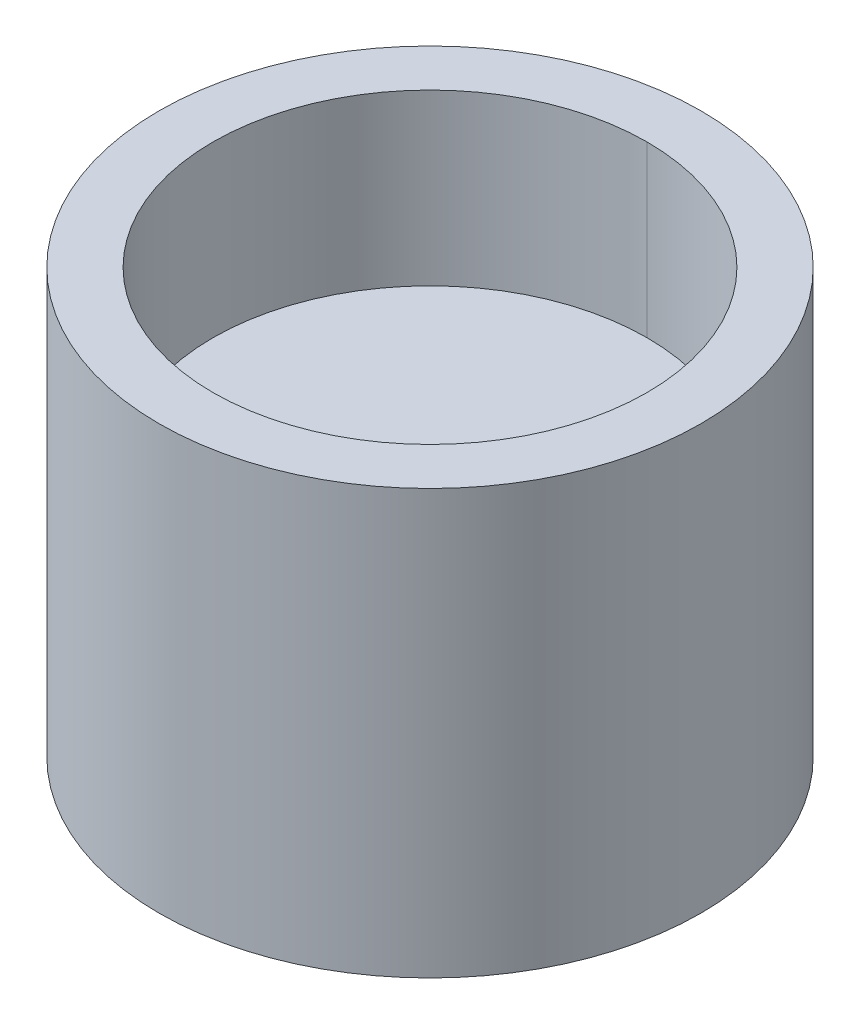
ISO-10303-21;
HEADER;
FILE_DESCRIPTION(('STEP AP214'),'2;1');
FILE_NAME('part.step','',(''),(''),'','','');
FILE_SCHEMA(('AUTOMOTIVE_DESIGN { 1 0 10303 214 1 1 1 1 }'));
ENDSEC;
DATA;
#1=APPLICATION_CONTEXT('core data for automotive mechanical design processes');
#2=APPLICATION_PROTOCOL_DEFINITION('international standard','automotive_design',2000,#1);
#3=PRODUCT_CONTEXT('',#1,'mechanical');
#4=PRODUCT('Part','Part','',(#3));
#5=PRODUCT_RELATED_PRODUCT_CATEGORY('part','',(#4));
#6=PRODUCT_DEFINITION_FORMATION('','',#4);
#7=PRODUCT_DEFINITION_CONTEXT('part definition',#1,'design');
#8=PRODUCT_DEFINITION('design','',#6,#7);
#9=PRODUCT_DEFINITION_SHAPE('','',#8);
#10=(LENGTH_UNIT() NAMED_UNIT(*) SI_UNIT(.MILLI.,.METRE.));
#11=(NAMED_UNIT(*) PLANE_ANGLE_UNIT() SI_UNIT($,.RADIAN.));
#12=(NAMED_UNIT(*) SI_UNIT($,.STERADIAN.) SOLID_ANGLE_UNIT());
#13=UNCERTAINTY_MEASURE_WITH_UNIT(LENGTH_MEASURE(1.E-05),#10,'distance_accuracy_value','');
#14=(GEOMETRIC_REPRESENTATION_CONTEXT(3) GLOBAL_UNCERTAINTY_ASSIGNED_CONTEXT((#13)) GLOBAL_UNIT_ASSIGNED_CONTEXT((#10,
#11,#12)) REPRESENTATION_CONTEXT('',''));
#15=CARTESIAN_POINT('',(0.,0.,0.));
#16=DIRECTION('',(0.,0.,1.));
#17=DIRECTION('',(1.,0.,0.));
#18=AXIS2_PLACEMENT_3D('',#15,#16,#17);
#19=CARTESIAN_POINT('',(12.5,14.,0.));
#20=DIRECTION('',(0.,1.,0.));
#21=DIRECTION('',(1.,0.,0.));
#22=AXIS2_PLACEMENT_3D('',#19,#20,#21);
#23=PLANE('',#22);
#24=CARTESIAN_POINT('',(12.5,14.,0.));
#25=DIRECTION('',(0.,1.,0.));
#26=DIRECTION('',(0.,0.,1.));
#27=AXIS2_PLACEMENT_3D('',#24,#25,#26);
#28=CIRCLE('',#27,6.4);
#29=CARTESIAN_POINT('',(12.5,14.,6.4));
#30=VERTEX_POINT('',#29);
#31=CARTESIAN_POINT('',(12.5,14.,-6.4));
#32=VERTEX_POINT('',#31);
#33=EDGE_CURVE('E87',#30,#32,#28,.T.);
#34=ORIENTED_EDGE('',*,*,#33,.F.);
#35=CARTESIAN_POINT('',(12.5,14.,0.));
#36=DIRECTION('',(0.,1.,0.));
#37=DIRECTION('',(0.,0.,1.));
#38=AXIS2_PLACEMENT_3D('',#35,#36,#37);
#39=CIRCLE('',#38,6.4);
#40=EDGE_CURVE('E50',#32,#30,#39,.T.);
#41=ORIENTED_EDGE('',*,*,#40,.F.);
#42=EDGE_LOOP('',(#34,#41));
#43=FACE_BOUND('',#42,.T.);
#44=CARTESIAN_POINT('',(12.5,14.,0.));
#45=DIRECTION('',(0.,1.,0.));
#46=DIRECTION('',(0.,0.,1.));
#47=AXIS2_PLACEMENT_3D('',#44,#45,#46);
#48=CIRCLE('',#47,7.99);
#49=CARTESIAN_POINT('',(12.5,14.,7.99));
#50=VERTEX_POINT('',#49);
#51=EDGE_CURVE('E102',#50,#50,#48,.T.);
#52=ORIENTED_EDGE('',*,*,#51,.T.);
#53=EDGE_LOOP('',(#52));
#54=FACE_BOUND('',#53,.T.);
#55=ADVANCED_FACE('F46',(#43,#54),#23,.T.);
#56=CARTESIAN_POINT('',(12.5,9.,0.));
#57=DIRECTION('',(0.,1.,0.));
#58=DIRECTION('',(0.,0.,1.));
#59=AXIS2_PLACEMENT_3D('',#56,#57,#58);
#60=CYLINDRICAL_SURFACE('',#59,6.4);
#61=CARTESIAN_POINT('',(12.5,9.,0.));
#62=DIRECTION('',(0.,1.,0.));
#63=DIRECTION('',(0.,0.,1.));
#64=AXIS2_PLACEMENT_3D('',#61,#62,#63);
#65=CIRCLE('',#64,6.4);
#66=CARTESIAN_POINT('',(12.5,9.,-6.4));
#67=VERTEX_POINT('',#66);
#68=CARTESIAN_POINT('',(12.5,9.,6.4));
#69=VERTEX_POINT('',#68);
#70=EDGE_CURVE('E68',#67,#69,#65,.T.);
#71=ORIENTED_EDGE('',*,*,#70,.F.);
#72=DIRECTION('',(0.,1.,0.));
#73=VECTOR('',#72,1.);
#74=CARTESIAN_POINT('',(12.5,9.,-6.4));
#75=LINE('',#74,#73);
#76=EDGE_CURVE('E11',#67,#32,#75,.T.);
#77=ORIENTED_EDGE('',*,*,#76,.T.);
#78=ORIENTED_EDGE('',*,*,#40,.T.);
#79=DIRECTION('',(0.,1.,0.));
#80=VECTOR('',#79,1.);
#81=CARTESIAN_POINT('',(12.5,9.,6.4));
#82=LINE('',#81,#80);
#83=EDGE_CURVE('E83',#69,#30,#82,.T.);
#84=ORIENTED_EDGE('',*,*,#83,.F.);
#85=EDGE_LOOP('',(#71,#77,#78,#84));
#86=FACE_BOUND('',#85,.T.);
#87=ADVANCED_FACE('F91',(#86),#60,.F.);
#88=CARTESIAN_POINT('',(12.5,9.,0.));
#89=DIRECTION('',(0.,1.,0.));
#90=DIRECTION('',(0.,0.,1.));
#91=AXIS2_PLACEMENT_3D('',#88,#89,#90);
#92=CYLINDRICAL_SURFACE('',#91,6.4);
#93=ORIENTED_EDGE('',*,*,#76,.F.);
#94=CARTESIAN_POINT('',(12.5,9.,0.));
#95=DIRECTION('',(0.,1.,0.));
#96=DIRECTION('',(0.,0.,1.));
#97=AXIS2_PLACEMENT_3D('',#94,#95,#96);
#98=CIRCLE('',#97,6.4);
#99=EDGE_CURVE('E88',#69,#67,#98,.T.);
#100=ORIENTED_EDGE('',*,*,#99,.F.);
#101=ORIENTED_EDGE('',*,*,#83,.T.);
#102=ORIENTED_EDGE('',*,*,#33,.T.);
#103=EDGE_LOOP('',(#93,#100,#101,#102));
#104=FACE_BOUND('',#103,.T.);
#105=ADVANCED_FACE('F85',(#104),#92,.F.);
#106=CARTESIAN_POINT('',(12.5,9.,0.));
#107=DIRECTION('',(0.,1.,0.));
#108=DIRECTION('',(1.,0.,0.));
#109=AXIS2_PLACEMENT_3D('',#106,#107,#108);
#110=PLANE('',#109);
#111=ORIENTED_EDGE('',*,*,#99,.T.);
#112=ORIENTED_EDGE('',*,*,#70,.T.);
#113=EDGE_LOOP('',(#111,#112));
#114=FACE_BOUND('',#113,.T.);
#115=ADVANCED_FACE('F114',(#114),#110,.T.);
#116=CARTESIAN_POINT('',(12.5,-25.1348611347611,0.));
#117=DIRECTION('',(0.,1.,0.));
#118=DIRECTION('',(0.,0.,1.));
#119=AXIS2_PLACEMENT_3D('',#116,#117,#118);
#120=CYLINDRICAL_SURFACE('',#119,7.99);
#121=ORIENTED_EDGE('',*,*,#51,.F.);
#122=EDGE_LOOP('',(#121));
#123=FACE_BOUND('',#122,.T.);
#124=CARTESIAN_POINT('',(12.5,1.5,0.));
#125=DIRECTION('',(0.,-1.,0.));
#126=DIRECTION('',(0.,0.,-1.));
#127=AXIS2_PLACEMENT_3D('',#124,#125,#126);
#128=CIRCLE('',#127,7.99);
#129=CARTESIAN_POINT('',(12.5,1.5,-7.99));
#130=VERTEX_POINT('',#129);
#131=EDGE_CURVE('E104',#130,#130,#128,.F.);
#132=ORIENTED_EDGE('',*,*,#131,.T.);
#133=EDGE_LOOP('',(#132));
#134=FACE_BOUND('',#133,.T.);
#135=ADVANCED_FACE('F112',(#123,#134),#120,.T.);
#136=CARTESIAN_POINT('',(12.5,1.5,0.));
#137=DIRECTION('',(0.,1.,0.));
#138=DIRECTION('',(1.,0.,0.));
#139=AXIS2_PLACEMENT_3D('',#136,#137,#138);
#140=PLANE('',#139);
#141=ORIENTED_EDGE('',*,*,#131,.F.);
#142=EDGE_LOOP('',(#141));
#143=FACE_BOUND('',#142,.T.);
#144=ADVANCED_FACE('F48',(#143),#140,.F.);
#145=CLOSED_SHELL('',(#55,#87,#105,#115,#135,#144));
#146=MANIFOLD_SOLID_BREP('B2',#145);
#147=ADVANCED_BREP_SHAPE_REPRESENTATION('',(#18,#146),#14);
#148=SHAPE_DEFINITION_REPRESENTATION(#9,#147);
ENDSEC;
END-ISO-10303-21;
